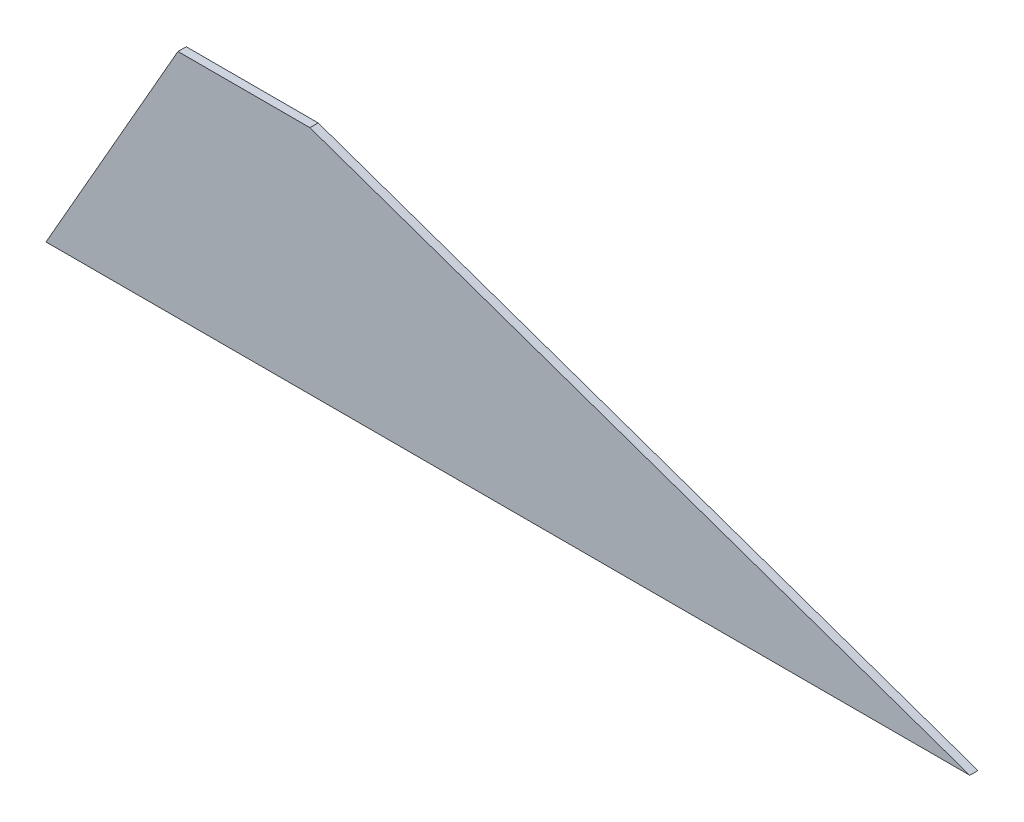
ISO-10303-21;
HEADER;
FILE_DESCRIPTION(('STEP AP214'),'2;1');
FILE_NAME('part.step','',(''),(''),'','','');
FILE_SCHEMA(('AUTOMOTIVE_DESIGN { 1 0 10303 214 1 1 1 1 }'));
ENDSEC;
DATA;
#1=APPLICATION_CONTEXT('core data for automotive mechanical design processes');
#2=APPLICATION_PROTOCOL_DEFINITION('international standard','automotive_design',2000,#1);
#3=PRODUCT_CONTEXT('',#1,'mechanical');
#4=PRODUCT('Part','Part','',(#3));
#5=PRODUCT_RELATED_PRODUCT_CATEGORY('part','',(#4));
#6=PRODUCT_DEFINITION_FORMATION('','',#4);
#7=PRODUCT_DEFINITION_CONTEXT('part definition',#1,'design');
#8=PRODUCT_DEFINITION('design','',#6,#7);
#9=PRODUCT_DEFINITION_SHAPE('','',#8);
#10=(LENGTH_UNIT() NAMED_UNIT(*) SI_UNIT(.MILLI.,.METRE.));
#11=(NAMED_UNIT(*) PLANE_ANGLE_UNIT() SI_UNIT($,.RADIAN.));
#12=(NAMED_UNIT(*) SI_UNIT($,.STERADIAN.) SOLID_ANGLE_UNIT());
#13=UNCERTAINTY_MEASURE_WITH_UNIT(LENGTH_MEASURE(1.E-05),#10,'distance_accuracy_value','');
#14=(GEOMETRIC_REPRESENTATION_CONTEXT(3) GLOBAL_UNCERTAINTY_ASSIGNED_CONTEXT((#13)) GLOBAL_UNIT_ASSIGNED_CONTEXT((#10,
#11,#12)) REPRESENTATION_CONTEXT('',''));
#15=CARTESIAN_POINT('',(0.,0.,0.));
#16=DIRECTION('',(0.,0.,1.));
#17=DIRECTION('',(1.,0.,0.));
#18=AXIS2_PLACEMENT_3D('',#15,#16,#17);
#19=CARTESIAN_POINT('',(-254.,88.8999999999999,3.175));
#20=DIRECTION('',(-0.330350424728106,-0.943858356366017,0.));
#21=DIRECTION('',(0.943858356366017,-0.330350424728106,0.));
#22=AXIS2_PLACEMENT_3D('',#19,#20,#21);
#23=PLANE('',#22);
#24=DIRECTION('',(-0.943858356366017,0.330350424728106,0.));
#25=VECTOR('',#24,1.);
#26=CARTESIAN_POINT('',(-254.,88.8999999999999,0.));
#27=LINE('',#26,#25);
#28=CARTESIAN_POINT('',(0.,0.,0.));
#29=VERTEX_POINT('',#28);
#30=CARTESIAN_POINT('',(-254.,88.8999999999999,0.));
#31=VERTEX_POINT('',#30);
#32=EDGE_CURVE('E96',#29,#31,#27,.T.);
#33=ORIENTED_EDGE('',*,*,#32,.T.);
#34=DIRECTION('',(0.,0.,-1.));
#35=VECTOR('',#34,1.);
#36=CARTESIAN_POINT('',(-254.,88.8999999999999,3.175));
#37=LINE('',#36,#35);
#38=CARTESIAN_POINT('',(-254.,88.8999999999999,3.175));
#39=VERTEX_POINT('',#38);
#40=EDGE_CURVE('E11',#39,#31,#37,.T.);
#41=ORIENTED_EDGE('',*,*,#40,.F.);
#42=DIRECTION('',(-0.943858356366017,0.330350424728106,0.));
#43=VECTOR('',#42,1.);
#44=CARTESIAN_POINT('',(-254.,88.8999999999999,3.175));
#45=LINE('',#44,#43);
#46=CARTESIAN_POINT('',(0.,0.,3.175));
#47=VERTEX_POINT('',#46);
#48=EDGE_CURVE('E84',#47,#39,#45,.T.);
#49=ORIENTED_EDGE('',*,*,#48,.F.);
#50=DIRECTION('',(0.,0.,-1.));
#51=VECTOR('',#50,1.);
#52=CARTESIAN_POINT('',(0.,0.,3.175));
#53=LINE('',#52,#51);
#54=EDGE_CURVE('E92',#47,#29,#53,.T.);
#55=ORIENTED_EDGE('',*,*,#54,.T.);
#56=EDGE_LOOP('',(#33,#41,#49,#55));
#57=FACE_BOUND('',#56,.T.);
#58=ADVANCED_FACE('F33',(#57),#23,.F.);
#59=CARTESIAN_POINT('',(-304.8,88.8999999999999,3.175));
#60=DIRECTION('',(0.,-1.,0.));
#61=DIRECTION('',(0.,0.,-1.));
#62=AXIS2_PLACEMENT_3D('',#59,#60,#61);
#63=PLANE('',#62);
#64=DIRECTION('',(-1.,0.,0.));
#65=VECTOR('',#64,1.);
#66=CARTESIAN_POINT('',(-304.8,88.8999999999999,0.));
#67=LINE('',#66,#65);
#68=CARTESIAN_POINT('',(-304.8,88.8999999999999,0.));
#69=VERTEX_POINT('',#68);
#70=EDGE_CURVE('E88',#31,#69,#67,.T.);
#71=ORIENTED_EDGE('',*,*,#70,.T.);
#72=DIRECTION('',(0.,0.,-1.));
#73=VECTOR('',#72,1.);
#74=CARTESIAN_POINT('',(-304.8,88.8999999999999,3.175));
#75=LINE('',#74,#73);
#76=CARTESIAN_POINT('',(-304.8,88.8999999999999,3.175));
#77=VERTEX_POINT('',#76);
#78=EDGE_CURVE('E41',#77,#69,#75,.T.);
#79=ORIENTED_EDGE('',*,*,#78,.F.);
#80=DIRECTION('',(-1.,0.,0.));
#81=VECTOR('',#80,1.);
#82=CARTESIAN_POINT('',(-304.8,88.8999999999999,3.175));
#83=LINE('',#82,#81);
#84=EDGE_CURVE('E79',#39,#77,#83,.T.);
#85=ORIENTED_EDGE('',*,*,#84,.F.);
#86=ORIENTED_EDGE('',*,*,#40,.T.);
#87=EDGE_LOOP('',(#71,#79,#85,#86));
#88=FACE_BOUND('',#87,.T.);
#89=ADVANCED_FACE('F87',(#88),#63,.F.);
#90=CARTESIAN_POINT('',(-355.6,0.,3.175));
#91=DIRECTION('',(0.868243142124459,-0.496138938356834,0.));
#92=DIRECTION('',(0.496138938356834,0.868243142124459,0.));
#93=AXIS2_PLACEMENT_3D('',#90,#91,#92);
#94=PLANE('',#93);
#95=DIRECTION('',(-0.496138938356834,-0.868243142124459,0.));
#96=VECTOR('',#95,1.);
#97=CARTESIAN_POINT('',(-355.6,0.,0.));
#98=LINE('',#97,#96);
#99=CARTESIAN_POINT('',(-355.6,0.,0.));
#100=VERTEX_POINT('',#99);
#101=EDGE_CURVE('E66',#69,#100,#98,.T.);
#102=ORIENTED_EDGE('',*,*,#101,.T.);
#103=DIRECTION('',(0.,0.,-1.));
#104=VECTOR('',#103,1.);
#105=CARTESIAN_POINT('',(-355.6,0.,3.175));
#106=LINE('',#105,#104);
#107=CARTESIAN_POINT('',(-355.6,0.,3.175));
#108=VERTEX_POINT('',#107);
#109=EDGE_CURVE('E89',#108,#100,#106,.T.);
#110=ORIENTED_EDGE('',*,*,#109,.F.);
#111=DIRECTION('',(-0.496138938356834,-0.868243142124459,0.));
#112=VECTOR('',#111,1.);
#113=CARTESIAN_POINT('',(-355.6,0.,3.175));
#114=LINE('',#113,#112);
#115=EDGE_CURVE('E82',#77,#108,#114,.T.);
#116=ORIENTED_EDGE('',*,*,#115,.F.);
#117=ORIENTED_EDGE('',*,*,#78,.T.);
#118=EDGE_LOOP('',(#102,#110,#116,#117));
#119=FACE_BOUND('',#118,.T.);
#120=ADVANCED_FACE('F90',(#119),#94,.F.);
#121=CARTESIAN_POINT('',(0.,0.,3.175));
#122=DIRECTION('',(0.,1.,0.));
#123=DIRECTION('',(-1.,0.,0.));
#124=AXIS2_PLACEMENT_3D('',#121,#122,#123);
#125=PLANE('',#124);
#126=DIRECTION('',(1.,0.,0.));
#127=VECTOR('',#126,1.);
#128=CARTESIAN_POINT('',(0.,0.,0.));
#129=LINE('',#128,#127);
#130=EDGE_CURVE('E72',#100,#29,#129,.T.);
#131=ORIENTED_EDGE('',*,*,#130,.T.);
#132=ORIENTED_EDGE('',*,*,#54,.F.);
#133=DIRECTION('',(1.,0.,0.));
#134=VECTOR('',#133,1.);
#135=CARTESIAN_POINT('',(0.,0.,3.175));
#136=LINE('',#135,#134);
#137=EDGE_CURVE('E49',#108,#47,#136,.T.);
#138=ORIENTED_EDGE('',*,*,#137,.F.);
#139=ORIENTED_EDGE('',*,*,#109,.T.);
#140=EDGE_LOOP('',(#131,#132,#138,#139));
#141=FACE_BOUND('',#140,.T.);
#142=ADVANCED_FACE('F103',(#141),#125,.F.);
#143=CARTESIAN_POINT('',(0.,0.,3.175));
#144=DIRECTION('',(0.,0.,1.));
#145=DIRECTION('',(1.,0.,0.));
#146=AXIS2_PLACEMENT_3D('',#143,#144,#145);
#147=PLANE('',#146);
#148=ORIENTED_EDGE('',*,*,#48,.T.);
#149=ORIENTED_EDGE('',*,*,#84,.T.);
#150=ORIENTED_EDGE('',*,*,#115,.T.);
#151=ORIENTED_EDGE('',*,*,#137,.T.);
#152=EDGE_LOOP('',(#148,#149,#150,#151));
#153=FACE_BOUND('',#152,.T.);
#154=ADVANCED_FACE('F80',(#153),#147,.T.);
#155=CARTESIAN_POINT('',(0.,0.,0.));
#156=DIRECTION('',(0.,0.,1.));
#157=DIRECTION('',(1.,0.,0.));
#158=AXIS2_PLACEMENT_3D('',#155,#156,#157);
#159=PLANE('',#158);
#160=ORIENTED_EDGE('',*,*,#32,.F.);
#161=ORIENTED_EDGE('',*,*,#130,.F.);
#162=ORIENTED_EDGE('',*,*,#101,.F.);
#163=ORIENTED_EDGE('',*,*,#70,.F.);
#164=EDGE_LOOP('',(#160,#161,#162,#163));
#165=FACE_BOUND('',#164,.T.);
#166=ADVANCED_FACE('F106',(#165),#159,.F.);
#167=CLOSED_SHELL('',(#58,#89,#120,#142,#154,#166));
#168=MANIFOLD_SOLID_BREP('B2',#167);
#169=ADVANCED_BREP_SHAPE_REPRESENTATION('',(#18,#168),#14);
#170=SHAPE_DEFINITION_REPRESENTATION(#9,#169);
ENDSEC;
END-ISO-10303-21;
